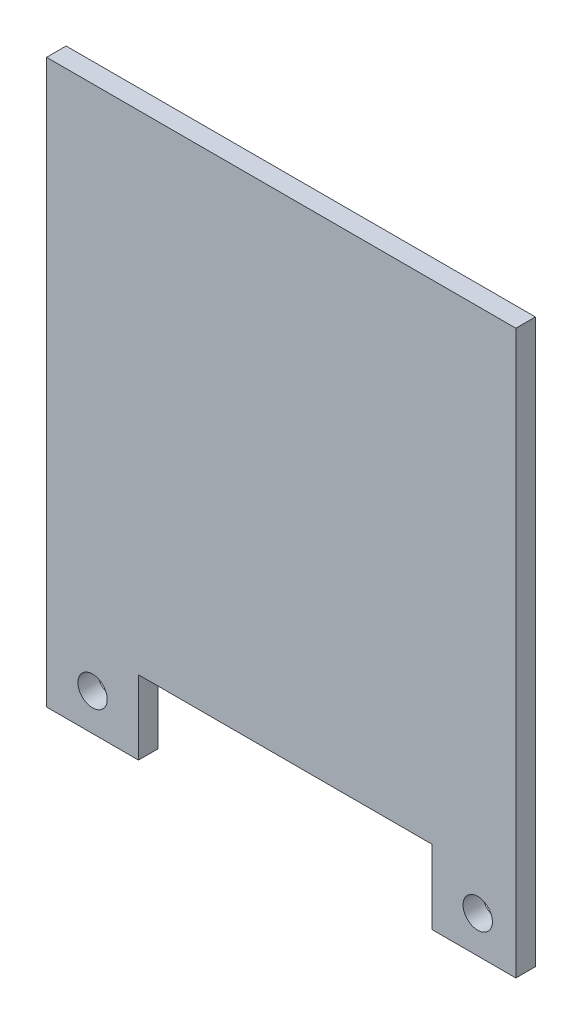
ISO-10303-21;
HEADER;
FILE_DESCRIPTION(('STEP AP214'),'2;1');
FILE_NAME('part.step','',(''),(''),'','','');
FILE_SCHEMA(('AUTOMOTIVE_DESIGN { 1 0 10303 214 1 1 1 1 }'));
ENDSEC;
DATA;
#1=APPLICATION_CONTEXT('core data for automotive mechanical design processes');
#2=APPLICATION_PROTOCOL_DEFINITION('international standard','automotive_design',2000,#1);
#3=PRODUCT_CONTEXT('',#1,'mechanical');
#4=PRODUCT('Part','Part','',(#3));
#5=PRODUCT_RELATED_PRODUCT_CATEGORY('part','',(#4));
#6=PRODUCT_DEFINITION_FORMATION('','',#4);
#7=PRODUCT_DEFINITION_CONTEXT('part definition',#1,'design');
#8=PRODUCT_DEFINITION('design','',#6,#7);
#9=PRODUCT_DEFINITION_SHAPE('','',#8);
#10=(LENGTH_UNIT() NAMED_UNIT(*) SI_UNIT(.MILLI.,.METRE.));
#11=(NAMED_UNIT(*) PLANE_ANGLE_UNIT() SI_UNIT($,.RADIAN.));
#12=(NAMED_UNIT(*) SI_UNIT($,.STERADIAN.) SOLID_ANGLE_UNIT());
#13=UNCERTAINTY_MEASURE_WITH_UNIT(LENGTH_MEASURE(1.E-05),#10,'distance_accuracy_value','');
#14=(GEOMETRIC_REPRESENTATION_CONTEXT(3) GLOBAL_UNCERTAINTY_ASSIGNED_CONTEXT((#13)) GLOBAL_UNIT_ASSIGNED_CONTEXT((#10,
#11,#12)) REPRESENTATION_CONTEXT('',''));
#15=CARTESIAN_POINT('',(0.,0.,0.));
#16=DIRECTION('',(0.,0.,1.));
#17=DIRECTION('',(1.,0.,0.));
#18=AXIS2_PLACEMENT_3D('',#15,#16,#17);
#19=CARTESIAN_POINT('',(30.48,36.5506,2.54));
#20=DIRECTION('',(-1.,0.,0.));
#21=DIRECTION('',(0.,-1.,0.));
#22=AXIS2_PLACEMENT_3D('',#19,#20,#21);
#23=PLANE('',#22);
#24=DIRECTION('',(0.,1.,0.));
#25=VECTOR('',#24,1.);
#26=CARTESIAN_POINT('',(30.48,36.5506,0.));
#27=LINE('',#26,#25);
#28=CARTESIAN_POINT('',(30.48,-36.5506,0.));
#29=VERTEX_POINT('',#28);
#30=CARTESIAN_POINT('',(30.48,36.5506,0.));
#31=VERTEX_POINT('',#30);
#32=EDGE_CURVE('E129',#29,#31,#27,.T.);
#33=ORIENTED_EDGE('',*,*,#32,.T.);
#34=DIRECTION('',(0.,0.,-1.));
#35=VECTOR('',#34,1.);
#36=CARTESIAN_POINT('',(30.48,36.5506,2.54));
#37=LINE('',#36,#35);
#38=CARTESIAN_POINT('',(30.48,36.5506,2.54));
#39=VERTEX_POINT('',#38);
#40=EDGE_CURVE('E11',#39,#31,#37,.T.);
#41=ORIENTED_EDGE('',*,*,#40,.F.);
#42=DIRECTION('',(0.,1.,0.));
#43=VECTOR('',#42,1.);
#44=CARTESIAN_POINT('',(30.48,36.5506,2.54));
#45=LINE('',#44,#43);
#46=CARTESIAN_POINT('',(30.48,-36.5506,2.54));
#47=VERTEX_POINT('',#46);
#48=EDGE_CURVE('E144',#47,#39,#45,.T.);
#49=ORIENTED_EDGE('',*,*,#48,.F.);
#50=DIRECTION('',(0.,0.,-1.));
#51=VECTOR('',#50,1.);
#52=CARTESIAN_POINT('',(30.48,-36.5506,2.54));
#53=LINE('',#52,#51);
#54=EDGE_CURVE('E125',#47,#29,#53,.T.);
#55=ORIENTED_EDGE('',*,*,#54,.T.);
#56=EDGE_LOOP('',(#33,#41,#49,#55));
#57=FACE_BOUND('',#56,.T.);
#58=ADVANCED_FACE('F33',(#57),#23,.F.);
#59=CARTESIAN_POINT('',(-30.48,36.5506,2.54));
#60=DIRECTION('',(0.,-1.,0.));
#61=DIRECTION('',(0.,0.,-1.));
#62=AXIS2_PLACEMENT_3D('',#59,#60,#61);
#63=PLANE('',#62);
#64=DIRECTION('',(-1.,0.,0.));
#65=VECTOR('',#64,1.);
#66=CARTESIAN_POINT('',(-30.48,36.5506,0.));
#67=LINE('',#66,#65);
#68=CARTESIAN_POINT('',(-30.48,36.5506,0.));
#69=VERTEX_POINT('',#68);
#70=EDGE_CURVE('E132',#31,#69,#67,.T.);
#71=ORIENTED_EDGE('',*,*,#70,.T.);
#72=DIRECTION('',(0.,0.,-1.));
#73=VECTOR('',#72,1.);
#74=CARTESIAN_POINT('',(-30.48,36.5506,2.54));
#75=LINE('',#74,#73);
#76=CARTESIAN_POINT('',(-30.48,36.5506,2.54));
#77=VERTEX_POINT('',#76);
#78=EDGE_CURVE('E41',#77,#69,#75,.T.);
#79=ORIENTED_EDGE('',*,*,#78,.F.);
#80=DIRECTION('',(-1.,0.,0.));
#81=VECTOR('',#80,1.);
#82=CARTESIAN_POINT('',(-30.48,36.5506,2.54));
#83=LINE('',#82,#81);
#84=EDGE_CURVE('E92',#39,#77,#83,.T.);
#85=ORIENTED_EDGE('',*,*,#84,.F.);
#86=ORIENTED_EDGE('',*,*,#40,.T.);
#87=EDGE_LOOP('',(#71,#79,#85,#86));
#88=FACE_BOUND('',#87,.T.);
#89=ADVANCED_FACE('F213',(#88),#63,.F.);
#90=CARTESIAN_POINT('',(-30.48,36.5506,2.54));
#91=DIRECTION('',(1.,0.,0.));
#92=DIRECTION('',(0.,1.,0.));
#93=AXIS2_PLACEMENT_3D('',#90,#91,#92);
#94=PLANE('',#93);
#95=DIRECTION('',(0.,-1.,0.));
#96=VECTOR('',#95,1.);
#97=CARTESIAN_POINT('',(-30.48,36.5506,0.));
#98=LINE('',#97,#96);
#99=CARTESIAN_POINT('',(-30.48,-36.5506,0.));
#100=VERTEX_POINT('',#99);
#101=EDGE_CURVE('E135',#69,#100,#98,.T.);
#102=ORIENTED_EDGE('',*,*,#101,.T.);
#103=DIRECTION('',(0.,0.,-1.));
#104=VECTOR('',#103,1.);
#105=CARTESIAN_POINT('',(-30.48,-36.5506,2.54));
#106=LINE('',#105,#104);
#107=CARTESIAN_POINT('',(-30.48,-36.5506,2.54));
#108=VERTEX_POINT('',#107);
#109=EDGE_CURVE('E151',#108,#100,#106,.T.);
#110=ORIENTED_EDGE('',*,*,#109,.F.);
#111=DIRECTION('',(0.,-1.,0.));
#112=VECTOR('',#111,1.);
#113=CARTESIAN_POINT('',(-30.48,36.5506,2.54));
#114=LINE('',#113,#112);
#115=EDGE_CURVE('E159',#77,#108,#114,.T.);
#116=ORIENTED_EDGE('',*,*,#115,.F.);
#117=ORIENTED_EDGE('',*,*,#78,.T.);
#118=EDGE_LOOP('',(#102,#110,#116,#117));
#119=FACE_BOUND('',#118,.T.);
#120=ADVANCED_FACE('F157',(#119),#94,.F.);
#121=CARTESIAN_POINT('',(-30.48,-36.5506,2.54));
#122=DIRECTION('',(0.,1.,0.));
#123=DIRECTION('',(0.,0.,1.));
#124=AXIS2_PLACEMENT_3D('',#121,#122,#123);
#125=PLANE('',#124);
#126=DIRECTION('',(1.,0.,0.));
#127=VECTOR('',#126,1.);
#128=CARTESIAN_POINT('',(-30.48,-36.5506,0.));
#129=LINE('',#128,#127);
#130=CARTESIAN_POINT('',(-18.542,-36.5506,0.));
#131=VERTEX_POINT('',#130);
#132=EDGE_CURVE('E137',#100,#131,#129,.T.);
#133=ORIENTED_EDGE('',*,*,#132,.T.);
#134=DIRECTION('',(0.,0.,-1.));
#135=VECTOR('',#134,1.);
#136=CARTESIAN_POINT('',(-18.542,-36.5506,2.54));
#137=LINE('',#136,#135);
#138=CARTESIAN_POINT('',(-18.542,-36.5506,2.54));
#139=VERTEX_POINT('',#138);
#140=EDGE_CURVE('E148',#139,#131,#137,.T.);
#141=ORIENTED_EDGE('',*,*,#140,.F.);
#142=DIRECTION('',(1.,0.,0.));
#143=VECTOR('',#142,1.);
#144=CARTESIAN_POINT('',(-30.48,-36.5506,2.54));
#145=LINE('',#144,#143);
#146=EDGE_CURVE('E171',#108,#139,#145,.T.);
#147=ORIENTED_EDGE('',*,*,#146,.F.);
#148=ORIENTED_EDGE('',*,*,#109,.T.);
#149=EDGE_LOOP('',(#133,#141,#147,#148));
#150=FACE_BOUND('',#149,.T.);
#151=ADVANCED_FACE('F167',(#150),#125,.F.);
#152=CARTESIAN_POINT('',(-18.542,-26.9494,2.54));
#153=DIRECTION('',(-1.,0.,0.));
#154=DIRECTION('',(0.,0.,1.));
#155=AXIS2_PLACEMENT_3D('',#152,#153,#154);
#156=PLANE('',#155);
#157=DIRECTION('',(0.,1.,0.));
#158=VECTOR('',#157,1.);
#159=CARTESIAN_POINT('',(-18.542,-26.9494,0.));
#160=LINE('',#159,#158);
#161=CARTESIAN_POINT('',(-18.542,-26.9494,0.));
#162=VERTEX_POINT('',#161);
#163=EDGE_CURVE('E139',#131,#162,#160,.T.);
#164=ORIENTED_EDGE('',*,*,#163,.T.);
#165=DIRECTION('',(0.,0.,-1.));
#166=VECTOR('',#165,1.);
#167=CARTESIAN_POINT('',(-18.542,-26.9494,2.54));
#168=LINE('',#167,#166);
#169=CARTESIAN_POINT('',(-18.542,-26.9494,2.54));
#170=VERTEX_POINT('',#169);
#171=EDGE_CURVE('E120',#170,#162,#168,.T.);
#172=ORIENTED_EDGE('',*,*,#171,.F.);
#173=DIRECTION('',(0.,1.,0.));
#174=VECTOR('',#173,1.);
#175=CARTESIAN_POINT('',(-18.542,-26.9494,2.54));
#176=LINE('',#175,#174);
#177=EDGE_CURVE('E111',#139,#170,#176,.T.);
#178=ORIENTED_EDGE('',*,*,#177,.F.);
#179=ORIENTED_EDGE('',*,*,#140,.T.);
#180=EDGE_LOOP('',(#164,#172,#178,#179));
#181=FACE_BOUND('',#180,.T.);
#182=ADVANCED_FACE('F170',(#181),#156,.F.);
#183=CARTESIAN_POINT('',(-18.542,-26.9494,2.54));
#184=DIRECTION('',(0.,1.,0.));
#185=DIRECTION('',(0.,0.,1.));
#186=AXIS2_PLACEMENT_3D('',#183,#184,#185);
#187=PLANE('',#186);
#188=DIRECTION('',(1.,0.,0.));
#189=VECTOR('',#188,1.);
#190=CARTESIAN_POINT('',(-18.542,-26.9494,0.));
#191=LINE('',#190,#189);
#192=CARTESIAN_POINT('',(19.558,-26.9494,0.));
#193=VERTEX_POINT('',#192);
#194=EDGE_CURVE('E119',#162,#193,#191,.T.);
#195=ORIENTED_EDGE('',*,*,#194,.T.);
#196=DIRECTION('',(0.,0.,-1.));
#197=VECTOR('',#196,1.);
#198=CARTESIAN_POINT('',(19.558,-26.9494,2.54));
#199=LINE('',#198,#197);
#200=CARTESIAN_POINT('',(19.558,-26.9494,2.54));
#201=VERTEX_POINT('',#200);
#202=EDGE_CURVE('E116',#201,#193,#199,.T.);
#203=ORIENTED_EDGE('',*,*,#202,.F.);
#204=DIRECTION('',(1.,0.,0.));
#205=VECTOR('',#204,1.);
#206=CARTESIAN_POINT('',(-18.542,-26.9494,2.54));
#207=LINE('',#206,#205);
#208=EDGE_CURVE('E105',#170,#201,#207,.T.);
#209=ORIENTED_EDGE('',*,*,#208,.F.);
#210=ORIENTED_EDGE('',*,*,#171,.T.);
#211=EDGE_LOOP('',(#195,#203,#209,#210));
#212=FACE_BOUND('',#211,.T.);
#213=ADVANCED_FACE('F117',(#212),#187,.F.);
#214=CARTESIAN_POINT('',(19.558,-26.9494,2.54));
#215=DIRECTION('',(1.,0.,0.));
#216=DIRECTION('',(0.,0.,-1.));
#217=AXIS2_PLACEMENT_3D('',#214,#215,#216);
#218=PLANE('',#217);
#219=DIRECTION('',(0.,-1.,0.));
#220=VECTOR('',#219,1.);
#221=CARTESIAN_POINT('',(19.558,-26.9494,0.));
#222=LINE('',#221,#220);
#223=CARTESIAN_POINT('',(19.558,-36.5506,0.));
#224=VERTEX_POINT('',#223);
#225=EDGE_CURVE('E78',#193,#224,#222,.T.);
#226=ORIENTED_EDGE('',*,*,#225,.T.);
#227=DIRECTION('',(0.,0.,-1.));
#228=VECTOR('',#227,1.);
#229=CARTESIAN_POINT('',(19.558,-36.5506,2.54));
#230=LINE('',#229,#228);
#231=CARTESIAN_POINT('',(19.558,-36.5506,2.54));
#232=VERTEX_POINT('',#231);
#233=EDGE_CURVE('E121',#232,#224,#230,.T.);
#234=ORIENTED_EDGE('',*,*,#233,.F.);
#235=DIRECTION('',(0.,-1.,0.));
#236=VECTOR('',#235,1.);
#237=CARTESIAN_POINT('',(19.558,-26.9494,2.54));
#238=LINE('',#237,#236);
#239=EDGE_CURVE('E109',#201,#232,#238,.T.);
#240=ORIENTED_EDGE('',*,*,#239,.F.);
#241=ORIENTED_EDGE('',*,*,#202,.T.);
#242=EDGE_LOOP('',(#226,#234,#240,#241));
#243=FACE_BOUND('',#242,.T.);
#244=ADVANCED_FACE('F123',(#243),#218,.F.);
#245=CARTESIAN_POINT('',(19.558,-36.5506,2.54));
#246=DIRECTION('',(0.,1.,0.));
#247=DIRECTION('',(0.,0.,1.));
#248=AXIS2_PLACEMENT_3D('',#245,#246,#247);
#249=PLANE('',#248);
#250=DIRECTION('',(1.,0.,0.));
#251=VECTOR('',#250,1.);
#252=CARTESIAN_POINT('',(19.558,-36.5506,0.));
#253=LINE('',#252,#251);
#254=EDGE_CURVE('E84',#224,#29,#253,.T.);
#255=ORIENTED_EDGE('',*,*,#254,.T.);
#256=ORIENTED_EDGE('',*,*,#54,.F.);
#257=DIRECTION('',(1.,0.,0.));
#258=VECTOR('',#257,1.);
#259=CARTESIAN_POINT('',(19.558,-36.5506,2.54));
#260=LINE('',#259,#258);
#261=EDGE_CURVE('E49',#232,#47,#260,.T.);
#262=ORIENTED_EDGE('',*,*,#261,.F.);
#263=ORIENTED_EDGE('',*,*,#233,.T.);
#264=EDGE_LOOP('',(#255,#256,#262,#263));
#265=FACE_BOUND('',#264,.T.);
#266=ADVANCED_FACE('F200',(#265),#249,.F.);
#267=CARTESIAN_POINT('',(0.,0.,2.54));
#268=DIRECTION('',(0.,0.,1.));
#269=DIRECTION('',(1.,0.,0.));
#270=AXIS2_PLACEMENT_3D('',#267,#268,#269);
#271=PLANE('',#270);
#272=CARTESIAN_POINT('',(25.527,-31.75,2.54));
#273=DIRECTION('',(0.,0.,1.));
#274=DIRECTION('',(1.,0.,0.));
#275=AXIS2_PLACEMENT_3D('',#272,#273,#274);
#276=CIRCLE('',#275,1.905);
#277=CARTESIAN_POINT('',(27.432,-31.75,2.54));
#278=VERTEX_POINT('',#277);
#279=EDGE_CURVE('E183',#278,#278,#276,.T.);
#280=ORIENTED_EDGE('',*,*,#279,.F.);
#281=EDGE_LOOP('',(#280));
#282=FACE_BOUND('',#281,.T.);
#283=CARTESIAN_POINT('',(-24.511,-31.75,2.54));
#284=DIRECTION('',(0.,0.,1.));
#285=DIRECTION('',(1.,0.,0.));
#286=AXIS2_PLACEMENT_3D('',#283,#284,#285);
#287=CIRCLE('',#286,1.905);
#288=CARTESIAN_POINT('',(-22.606,-31.75,2.54));
#289=VERTEX_POINT('',#288);
#290=EDGE_CURVE('E177',#289,#289,#287,.T.);
#291=ORIENTED_EDGE('',*,*,#290,.F.);
#292=EDGE_LOOP('',(#291));
#293=FACE_BOUND('',#292,.T.);
#294=ORIENTED_EDGE('',*,*,#48,.T.);
#295=ORIENTED_EDGE('',*,*,#84,.T.);
#296=ORIENTED_EDGE('',*,*,#115,.T.);
#297=ORIENTED_EDGE('',*,*,#146,.T.);
#298=ORIENTED_EDGE('',*,*,#177,.T.);
#299=ORIENTED_EDGE('',*,*,#208,.T.);
#300=ORIENTED_EDGE('',*,*,#239,.T.);
#301=ORIENTED_EDGE('',*,*,#261,.T.);
#302=EDGE_LOOP('',(#294,#295,#296,#297,#298,#299,#300,#301));
#303=FACE_BOUND('',#302,.T.);
#304=ADVANCED_FACE('F107',(#282,#293,#303),#271,.T.);
#305=CARTESIAN_POINT('',(0.,0.,0.));
#306=DIRECTION('',(0.,0.,1.));
#307=DIRECTION('',(1.,0.,0.));
#308=AXIS2_PLACEMENT_3D('',#305,#306,#307);
#309=PLANE('',#308);
#310=CARTESIAN_POINT('',(25.527,-31.75,0.));
#311=DIRECTION('',(0.,0.,1.));
#312=DIRECTION('',(1.,0.,0.));
#313=AXIS2_PLACEMENT_3D('',#310,#311,#312);
#314=CIRCLE('',#313,1.905);
#315=CARTESIAN_POINT('',(27.432,-31.75,0.));
#316=VERTEX_POINT('',#315);
#317=EDGE_CURVE('E180',#316,#316,#314,.T.);
#318=ORIENTED_EDGE('',*,*,#317,.T.);
#319=EDGE_LOOP('',(#318));
#320=FACE_BOUND('',#319,.T.);
#321=CARTESIAN_POINT('',(-24.511,-31.75,0.));
#322=DIRECTION('',(0.,0.,1.));
#323=DIRECTION('',(1.,0.,0.));
#324=AXIS2_PLACEMENT_3D('',#321,#322,#323);
#325=CIRCLE('',#324,1.905);
#326=CARTESIAN_POINT('',(-22.606,-31.75,0.));
#327=VERTEX_POINT('',#326);
#328=EDGE_CURVE('E133',#327,#327,#325,.T.);
#329=ORIENTED_EDGE('',*,*,#328,.T.);
#330=EDGE_LOOP('',(#329));
#331=FACE_BOUND('',#330,.T.);
#332=ORIENTED_EDGE('',*,*,#32,.F.);
#333=ORIENTED_EDGE('',*,*,#254,.F.);
#334=ORIENTED_EDGE('',*,*,#225,.F.);
#335=ORIENTED_EDGE('',*,*,#194,.F.);
#336=ORIENTED_EDGE('',*,*,#163,.F.);
#337=ORIENTED_EDGE('',*,*,#132,.F.);
#338=ORIENTED_EDGE('',*,*,#101,.F.);
#339=ORIENTED_EDGE('',*,*,#70,.F.);
#340=EDGE_LOOP('',(#332,#333,#334,#335,#336,#337,#338,#339));
#341=FACE_BOUND('',#340,.T.);
#342=ADVANCED_FACE('F163',(#320,#331,#341),#309,.F.);
#343=CARTESIAN_POINT('',(-24.511,-31.75,0.));
#344=DIRECTION('',(0.,0.,1.));
#345=DIRECTION('',(1.,0.,0.));
#346=AXIS2_PLACEMENT_3D('',#343,#344,#345);
#347=CYLINDRICAL_SURFACE('',#346,1.905);
#348=ORIENTED_EDGE('',*,*,#328,.F.);
#349=EDGE_LOOP('',(#348));
#350=FACE_BOUND('',#349,.T.);
#351=ORIENTED_EDGE('',*,*,#290,.T.);
#352=EDGE_LOOP('',(#351));
#353=FACE_BOUND('',#352,.T.);
#354=ADVANCED_FACE('F194',(#350,#353),#347,.F.);
#355=CARTESIAN_POINT('',(25.527,-31.75,0.));
#356=DIRECTION('',(0.,0.,1.));
#357=DIRECTION('',(1.,0.,0.));
#358=AXIS2_PLACEMENT_3D('',#355,#356,#357);
#359=CYLINDRICAL_SURFACE('',#358,1.905);
#360=ORIENTED_EDGE('',*,*,#317,.F.);
#361=EDGE_LOOP('',(#360));
#362=FACE_BOUND('',#361,.T.);
#363=ORIENTED_EDGE('',*,*,#279,.T.);
#364=EDGE_LOOP('',(#363));
#365=FACE_BOUND('',#364,.T.);
#366=ADVANCED_FACE('F191',(#362,#365),#359,.F.);
#367=CLOSED_SHELL('',(#58,#89,#120,#151,#182,#213,#244,#266,#304,#342,#354,#366));
#368=MANIFOLD_SOLID_BREP('B2',#367);
#369=ADVANCED_BREP_SHAPE_REPRESENTATION('',(#18,#368),#14);
#370=SHAPE_DEFINITION_REPRESENTATION(#9,#369);
ENDSEC;
END-ISO-10303-21;
